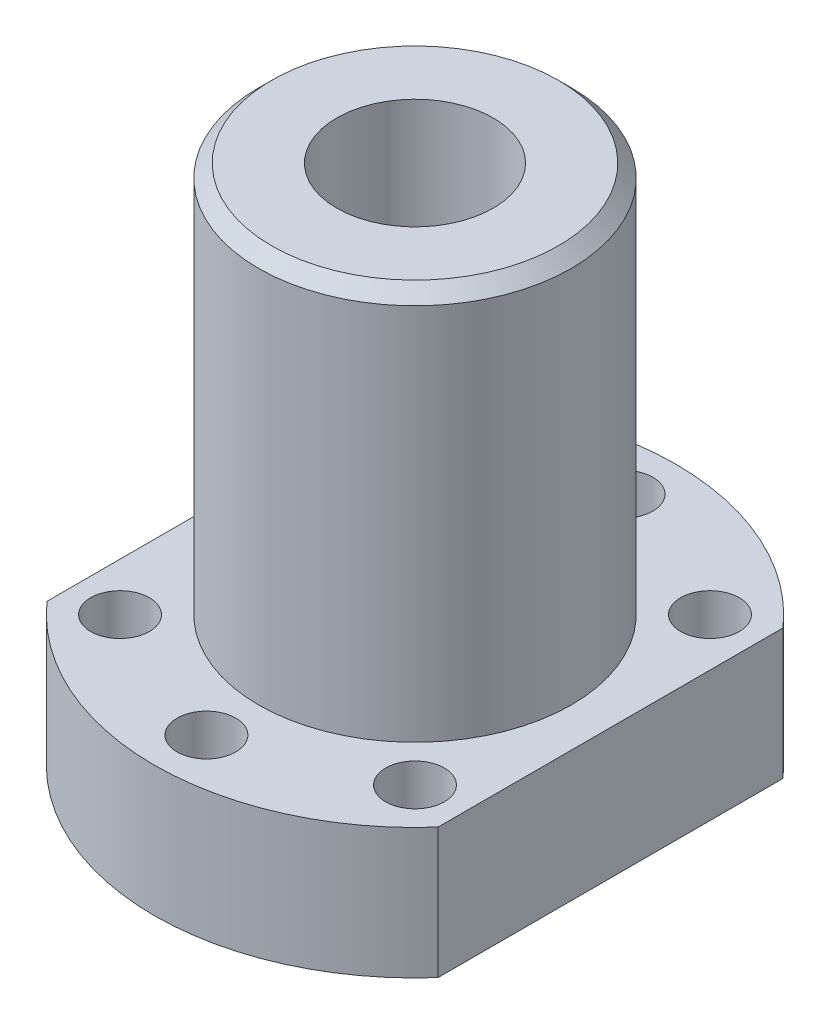
ISO-10303-21;
HEADER;
FILE_DESCRIPTION(('STEP AP214'),'2;1');
FILE_NAME('part.step','',(''),(''),'','','');
FILE_SCHEMA(('AUTOMOTIVE_DESIGN { 1 0 10303 214 1 1 1 1 }'));
ENDSEC;
DATA;
#1=APPLICATION_CONTEXT('core data for automotive mechanical design processes');
#2=APPLICATION_PROTOCOL_DEFINITION('international standard','automotive_design',2000,#1);
#3=PRODUCT_CONTEXT('',#1,'mechanical');
#4=PRODUCT('Part','Part','',(#3));
#5=PRODUCT_RELATED_PRODUCT_CATEGORY('part','',(#4));
#6=PRODUCT_DEFINITION_FORMATION('','',#4);
#7=PRODUCT_DEFINITION_CONTEXT('part definition',#1,'design');
#8=PRODUCT_DEFINITION('design','',#6,#7);
#9=PRODUCT_DEFINITION_SHAPE('','',#8);
#10=(LENGTH_UNIT() NAMED_UNIT(*) SI_UNIT(.MILLI.,.METRE.));
#11=(NAMED_UNIT(*) PLANE_ANGLE_UNIT() SI_UNIT($,.RADIAN.));
#12=(NAMED_UNIT(*) SI_UNIT($,.STERADIAN.) SOLID_ANGLE_UNIT());
#13=UNCERTAINTY_MEASURE_WITH_UNIT(LENGTH_MEASURE(1.E-05),#10,'distance_accuracy_value','');
#14=(GEOMETRIC_REPRESENTATION_CONTEXT(3) GLOBAL_UNCERTAINTY_ASSIGNED_CONTEXT((#13)) GLOBAL_UNIT_ASSIGNED_CONTEXT((#10,
#11,#12)) REPRESENTATION_CONTEXT('',''));
#15=CARTESIAN_POINT('',(0.,0.,0.));
#16=DIRECTION('',(0.,0.,1.));
#17=DIRECTION('',(1.,0.,0.));
#18=AXIS2_PLACEMENT_3D('',#15,#16,#17);
#19=CARTESIAN_POINT('',(0.,10.,0.));
#20=DIRECTION('',(0.,-1.,0.));
#21=DIRECTION('',(0.,0.,-1.));
#22=AXIS2_PLACEMENT_3D('',#19,#20,#21);
#23=PLANE('',#22);
#24=CARTESIAN_POINT('',(11.3137084989863,10.,11.3137084989862));
#25=DIRECTION('',(0.,1.,0.));
#26=DIRECTION('',(0.,0.,-1.));
#27=AXIS2_PLACEMENT_3D('',#24,#25,#26);
#28=CIRCLE('',#27,2.24999999999939);
#29=CARTESIAN_POINT('',(11.3137084989863,10.,9.06370849898682));
#30=VERTEX_POINT('',#29);
#31=EDGE_CURVE('E175',#30,#30,#28,.T.);
#32=ORIENTED_EDGE('',*,*,#31,.F.);
#33=EDGE_LOOP('',(#32));
#34=FACE_BOUND('',#33,.T.);
#35=CARTESIAN_POINT('',(0.,10.,16.));
#36=DIRECTION('',(0.,1.,0.));
#37=DIRECTION('',(0.,0.,-1.));
#38=AXIS2_PLACEMENT_3D('',#35,#36,#37);
#39=CIRCLE('',#38,2.25);
#40=CARTESIAN_POINT('',(0.,10.,13.75));
#41=VERTEX_POINT('',#40);
#42=EDGE_CURVE('E184',#41,#41,#39,.T.);
#43=ORIENTED_EDGE('',*,*,#42,.F.);
#44=EDGE_LOOP('',(#43));
#45=FACE_BOUND('',#44,.T.);
#46=CARTESIAN_POINT('',(-11.3137084989863,10.,11.3137084989862));
#47=DIRECTION('',(0.,1.,0.));
#48=DIRECTION('',(0.,0.,1.));
#49=AXIS2_PLACEMENT_3D('',#46,#47,#48);
#50=CIRCLE('',#49,2.24999999999939);
#51=CARTESIAN_POINT('',(-11.3137084989863,10.,13.5637084989856));
#52=VERTEX_POINT('',#51);
#53=EDGE_CURVE('E189',#52,#52,#50,.T.);
#54=ORIENTED_EDGE('',*,*,#53,.F.);
#55=EDGE_LOOP('',(#54));
#56=FACE_BOUND('',#55,.T.);
#57=CARTESIAN_POINT('',(11.3137084989863,10.,-11.3137084989862));
#58=DIRECTION('',(0.,1.,0.));
#59=DIRECTION('',(0.,0.,1.));
#60=AXIS2_PLACEMENT_3D('',#57,#58,#59);
#61=CIRCLE('',#60,2.24999999999939);
#62=CARTESIAN_POINT('',(11.3137084989863,10.,-9.06370849898682));
#63=VERTEX_POINT('',#62);
#64=EDGE_CURVE('E194',#63,#63,#61,.T.);
#65=ORIENTED_EDGE('',*,*,#64,.F.);
#66=EDGE_LOOP('',(#65));
#67=FACE_BOUND('',#66,.T.);
#68=CARTESIAN_POINT('',(0.,10.,-16.));
#69=DIRECTION('',(0.,1.,0.));
#70=DIRECTION('',(0.,0.,1.));
#71=AXIS2_PLACEMENT_3D('',#68,#69,#70);
#72=CIRCLE('',#71,2.25);
#73=CARTESIAN_POINT('',(0.,10.,-13.75));
#74=VERTEX_POINT('',#73);
#75=EDGE_CURVE('E199',#74,#74,#72,.T.);
#76=ORIENTED_EDGE('',*,*,#75,.F.);
#77=EDGE_LOOP('',(#76));
#78=FACE_BOUND('',#77,.T.);
#79=CARTESIAN_POINT('',(-11.3137084989863,10.,-11.3137084989862));
#80=DIRECTION('',(0.,1.,0.));
#81=DIRECTION('',(0.,0.,-1.));
#82=AXIS2_PLACEMENT_3D('',#79,#80,#81);
#83=CIRCLE('',#82,2.24999999999939);
#84=CARTESIAN_POINT('',(-11.3137084989863,10.,-13.5637084989856));
#85=VERTEX_POINT('',#84);
#86=EDGE_CURVE('E204',#85,#85,#83,.T.);
#87=ORIENTED_EDGE('',*,*,#86,.F.);
#88=EDGE_LOOP('',(#87));
#89=FACE_BOUND('',#88,.T.);
#90=CARTESIAN_POINT('',(0.,10.,0.));
#91=DIRECTION('',(0.,1.,0.));
#92=DIRECTION('',(0.,0.,-1.));
#93=AXIS2_PLACEMENT_3D('',#90,#91,#92);
#94=CIRCLE('',#93,20.);
#95=CARTESIAN_POINT('',(15.,10.,-13.2287565553229));
#96=VERTEX_POINT('',#95);
#97=CARTESIAN_POINT('',(-15.,10.,-13.2287565553229));
#98=VERTEX_POINT('',#97);
#99=EDGE_CURVE('E89',#96,#98,#94,.T.);
#100=ORIENTED_EDGE('',*,*,#99,.T.);
#101=DIRECTION('',(0.,0.,1.));
#102=VECTOR('',#101,1.);
#103=CARTESIAN_POINT('',(-15.,10.,-13.2287565553229));
#104=LINE('',#103,#102);
#105=CARTESIAN_POINT('',(-15.,10.,13.2287565553229));
#106=VERTEX_POINT('',#105);
#107=EDGE_CURVE('E84',#98,#106,#104,.T.);
#108=ORIENTED_EDGE('',*,*,#107,.T.);
#109=CARTESIAN_POINT('',(0.,10.,0.));
#110=DIRECTION('',(0.,1.,0.));
#111=DIRECTION('',(0.,0.,1.));
#112=AXIS2_PLACEMENT_3D('',#109,#110,#111);
#113=CIRCLE('',#112,20.);
#114=CARTESIAN_POINT('',(15.,10.,13.2287565553229));
#115=VERTEX_POINT('',#114);
#116=EDGE_CURVE('E87',#106,#115,#113,.T.);
#117=ORIENTED_EDGE('',*,*,#116,.T.);
#118=DIRECTION('',(0.,0.,-1.));
#119=VECTOR('',#118,1.);
#120=CARTESIAN_POINT('',(15.,10.,-13.2287565553229));
#121=LINE('',#120,#119);
#122=EDGE_CURVE('E53',#115,#96,#121,.T.);
#123=ORIENTED_EDGE('',*,*,#122,.T.);
#124=EDGE_LOOP('',(#100,#108,#117,#123));
#125=FACE_BOUND('',#124,.T.);
#126=CARTESIAN_POINT('',(0.,10.,0.));
#127=DIRECTION('',(0.,-1.,0.));
#128=DIRECTION('',(0.,0.,-1.));
#129=AXIS2_PLACEMENT_3D('',#126,#127,#128);
#130=CIRCLE('',#129,12.);
#131=CARTESIAN_POINT('',(0.,10.,-12.));
#132=VERTEX_POINT('',#131);
#133=EDGE_CURVE('E114',#132,#132,#130,.F.);
#134=ORIENTED_EDGE('',*,*,#133,.F.);
#135=EDGE_LOOP('',(#134));
#136=FACE_BOUND('',#135,.T.);
#137=ADVANCED_FACE('F36',(#34,#45,#56,#67,#78,#89,#125,#136),#23,.F.);
#138=CARTESIAN_POINT('',(0.,0.,0.));
#139=DIRECTION('',(0.,-1.,0.));
#140=DIRECTION('',(0.,0.,-1.));
#141=AXIS2_PLACEMENT_3D('',#138,#139,#140);
#142=PLANE('',#141);
#143=CARTESIAN_POINT('',(0.,0.,16.));
#144=DIRECTION('',(0.,1.,0.));
#145=DIRECTION('',(0.,0.,-1.));
#146=AXIS2_PLACEMENT_3D('',#143,#144,#145);
#147=CIRCLE('',#146,2.25);
#148=CARTESIAN_POINT('',(0.,0.,13.75));
#149=VERTEX_POINT('',#148);
#150=EDGE_CURVE('E179',#149,#149,#147,.T.);
#151=ORIENTED_EDGE('',*,*,#150,.T.);
#152=EDGE_LOOP('',(#151));
#153=FACE_BOUND('',#152,.T.);
#154=CARTESIAN_POINT('',(11.3137084989863,0.,-11.3137084989862));
#155=DIRECTION('',(0.,1.,0.));
#156=DIRECTION('',(0.,0.,1.));
#157=AXIS2_PLACEMENT_3D('',#154,#155,#156);
#158=CIRCLE('',#157,2.24999999999939);
#159=CARTESIAN_POINT('',(11.3137084989863,0.,-9.06370849898682));
#160=VERTEX_POINT('',#159);
#161=EDGE_CURVE('E192',#160,#160,#158,.T.);
#162=ORIENTED_EDGE('',*,*,#161,.T.);
#163=EDGE_LOOP('',(#162));
#164=FACE_BOUND('',#163,.T.);
#165=CARTESIAN_POINT('',(-11.3137084989863,0.,-11.3137084989862));
#166=DIRECTION('',(0.,1.,0.));
#167=DIRECTION('',(0.,0.,-1.));
#168=AXIS2_PLACEMENT_3D('',#165,#166,#167);
#169=CIRCLE('',#168,2.24999999999939);
#170=CARTESIAN_POINT('',(-11.3137084989863,0.,-13.5637084989856));
#171=VERTEX_POINT('',#170);
#172=EDGE_CURVE('E202',#171,#171,#169,.T.);
#173=ORIENTED_EDGE('',*,*,#172,.T.);
#174=EDGE_LOOP('',(#173));
#175=FACE_BOUND('',#174,.T.);
#176=CARTESIAN_POINT('',(0.,0.,0.));
#177=DIRECTION('',(0.,1.,0.));
#178=DIRECTION('',(0.,0.,-1.));
#179=AXIS2_PLACEMENT_3D('',#176,#177,#178);
#180=CIRCLE('',#179,20.);
#181=CARTESIAN_POINT('',(15.,0.,-13.2287565553229));
#182=VERTEX_POINT('',#181);
#183=CARTESIAN_POINT('',(-15.,0.,-13.2287565553229));
#184=VERTEX_POINT('',#183);
#185=EDGE_CURVE('E104',#182,#184,#180,.T.);
#186=ORIENTED_EDGE('',*,*,#185,.F.);
#187=DIRECTION('',(0.,0.,-1.));
#188=VECTOR('',#187,1.);
#189=CARTESIAN_POINT('',(15.,0.,-13.2287565553229));
#190=LINE('',#189,#188);
#191=CARTESIAN_POINT('',(15.,0.,13.2287565553229));
#192=VERTEX_POINT('',#191);
#193=EDGE_CURVE('E76',#192,#182,#190,.T.);
#194=ORIENTED_EDGE('',*,*,#193,.F.);
#195=CARTESIAN_POINT('',(0.,0.,0.));
#196=DIRECTION('',(0.,1.,0.));
#197=DIRECTION('',(0.,0.,1.));
#198=AXIS2_PLACEMENT_3D('',#195,#196,#197);
#199=CIRCLE('',#198,20.);
#200=CARTESIAN_POINT('',(-15.,0.,13.2287565553229));
#201=VERTEX_POINT('',#200);
#202=EDGE_CURVE('E70',#201,#192,#199,.T.);
#203=ORIENTED_EDGE('',*,*,#202,.F.);
#204=DIRECTION('',(0.,0.,1.));
#205=VECTOR('',#204,1.);
#206=CARTESIAN_POINT('',(-15.,0.,-13.2287565553229));
#207=LINE('',#206,#205);
#208=EDGE_CURVE('E94',#184,#201,#207,.T.);
#209=ORIENTED_EDGE('',*,*,#208,.F.);
#210=EDGE_LOOP('',(#186,#194,#203,#209));
#211=FACE_BOUND('',#210,.T.);
#212=CARTESIAN_POINT('',(0.,0.,0.));
#213=DIRECTION('',(0.,1.,0.));
#214=DIRECTION('',(0.,0.,1.));
#215=AXIS2_PLACEMENT_3D('',#212,#213,#214);
#216=CIRCLE('',#215,6.);
#217=CARTESIAN_POINT('',(0.,0.,6.));
#218=VERTEX_POINT('',#217);
#219=EDGE_CURVE('E107',#218,#218,#216,.T.);
#220=ORIENTED_EDGE('',*,*,#219,.T.);
#221=EDGE_LOOP('',(#220));
#222=FACE_BOUND('',#221,.T.);
#223=CARTESIAN_POINT('',(0.,0.,-16.));
#224=DIRECTION('',(0.,1.,0.));
#225=DIRECTION('',(0.,0.,1.));
#226=AXIS2_PLACEMENT_3D('',#223,#224,#225);
#227=CIRCLE('',#226,2.25);
#228=CARTESIAN_POINT('',(0.,0.,-13.75));
#229=VERTEX_POINT('',#228);
#230=EDGE_CURVE('E166',#229,#229,#227,.T.);
#231=ORIENTED_EDGE('',*,*,#230,.T.);
#232=EDGE_LOOP('',(#231));
#233=FACE_BOUND('',#232,.T.);
#234=CARTESIAN_POINT('',(-11.3137084989863,0.,11.3137084989862));
#235=DIRECTION('',(0.,1.,0.));
#236=DIRECTION('',(0.,0.,1.));
#237=AXIS2_PLACEMENT_3D('',#234,#235,#236);
#238=CIRCLE('',#237,2.24999999999939);
#239=CARTESIAN_POINT('',(-11.3137084989863,0.,13.5637084989856));
#240=VERTEX_POINT('',#239);
#241=EDGE_CURVE('E170',#240,#240,#238,.T.);
#242=ORIENTED_EDGE('',*,*,#241,.T.);
#243=EDGE_LOOP('',(#242));
#244=FACE_BOUND('',#243,.T.);
#245=CARTESIAN_POINT('',(11.3137084989863,0.,11.3137084989862));
#246=DIRECTION('',(0.,1.,0.));
#247=DIRECTION('',(0.,0.,-1.));
#248=AXIS2_PLACEMENT_3D('',#245,#246,#247);
#249=CIRCLE('',#248,2.24999999999939);
#250=CARTESIAN_POINT('',(11.3137084989863,0.,9.06370849898682));
#251=VERTEX_POINT('',#250);
#252=EDGE_CURVE('E173',#251,#251,#249,.T.);
#253=ORIENTED_EDGE('',*,*,#252,.T.);
#254=EDGE_LOOP('',(#253));
#255=FACE_BOUND('',#254,.T.);
#256=ADVANCED_FACE('F132',(#153,#164,#175,#211,#222,#233,#244,#255),#142,.T.);
#257=CARTESIAN_POINT('',(0.,10.,0.));
#258=DIRECTION('',(0.,-1.,0.));
#259=DIRECTION('',(0.,0.,-1.));
#260=AXIS2_PLACEMENT_3D('',#257,#258,#259);
#261=CYLINDRICAL_SURFACE('',#260,20.);
#262=ORIENTED_EDGE('',*,*,#185,.T.);
#263=DIRECTION('',(0.,-1.,0.));
#264=VECTOR('',#263,1.);
#265=CARTESIAN_POINT('',(-15.,10.,-13.2287565553229));
#266=LINE('',#265,#264);
#267=EDGE_CURVE('E95',#98,#184,#266,.T.);
#268=ORIENTED_EDGE('',*,*,#267,.F.);
#269=ORIENTED_EDGE('',*,*,#99,.F.);
#270=DIRECTION('',(0.,-1.,0.));
#271=VECTOR('',#270,1.);
#272=CARTESIAN_POINT('',(15.,10.,-13.2287565553229));
#273=LINE('',#272,#271);
#274=EDGE_CURVE('E100',#96,#182,#273,.T.);
#275=ORIENTED_EDGE('',*,*,#274,.T.);
#276=EDGE_LOOP('',(#262,#268,#269,#275));
#277=FACE_BOUND('',#276,.T.);
#278=ADVANCED_FACE('F138',(#277),#261,.T.);
#279=CARTESIAN_POINT('',(-15.,10.,-13.2287565553229));
#280=DIRECTION('',(1.,0.,0.));
#281=DIRECTION('',(0.,0.,-1.));
#282=AXIS2_PLACEMENT_3D('',#279,#280,#281);
#283=PLANE('',#282);
#284=ORIENTED_EDGE('',*,*,#208,.T.);
#285=DIRECTION('',(0.,-1.,0.));
#286=VECTOR('',#285,1.);
#287=CARTESIAN_POINT('',(-15.,10.,13.2287565553229));
#288=LINE('',#287,#286);
#289=EDGE_CURVE('E92',#106,#201,#288,.T.);
#290=ORIENTED_EDGE('',*,*,#289,.F.);
#291=ORIENTED_EDGE('',*,*,#107,.F.);
#292=ORIENTED_EDGE('',*,*,#267,.T.);
#293=EDGE_LOOP('',(#284,#290,#291,#292));
#294=FACE_BOUND('',#293,.T.);
#295=ADVANCED_FACE('F93',(#294),#283,.F.);
#296=CARTESIAN_POINT('',(0.,10.,0.));
#297=DIRECTION('',(0.,-1.,0.));
#298=DIRECTION('',(0.,0.,-1.));
#299=AXIS2_PLACEMENT_3D('',#296,#297,#298);
#300=CYLINDRICAL_SURFACE('',#299,20.);
#301=ORIENTED_EDGE('',*,*,#202,.T.);
#302=DIRECTION('',(0.,-1.,0.));
#303=VECTOR('',#302,1.);
#304=CARTESIAN_POINT('',(15.,10.,13.2287565553229));
#305=LINE('',#304,#303);
#306=EDGE_CURVE('E96',#115,#192,#305,.T.);
#307=ORIENTED_EDGE('',*,*,#306,.F.);
#308=ORIENTED_EDGE('',*,*,#116,.F.);
#309=ORIENTED_EDGE('',*,*,#289,.T.);
#310=EDGE_LOOP('',(#301,#307,#308,#309));
#311=FACE_BOUND('',#310,.T.);
#312=ADVANCED_FACE('F98',(#311),#300,.T.);
#313=CARTESIAN_POINT('',(15.,10.,-13.2287565553229));
#314=DIRECTION('',(-1.,0.,0.));
#315=DIRECTION('',(0.,0.,1.));
#316=AXIS2_PLACEMENT_3D('',#313,#314,#315);
#317=PLANE('',#316);
#318=ORIENTED_EDGE('',*,*,#193,.T.);
#319=ORIENTED_EDGE('',*,*,#274,.F.);
#320=ORIENTED_EDGE('',*,*,#122,.F.);
#321=ORIENTED_EDGE('',*,*,#306,.T.);
#322=EDGE_LOOP('',(#318,#319,#320,#321));
#323=FACE_BOUND('',#322,.T.);
#324=ADVANCED_FACE('F147',(#323),#317,.F.);
#325=CARTESIAN_POINT('',(0.,10.,0.));
#326=DIRECTION('',(0.,-1.,0.));
#327=DIRECTION('',(0.,0.,-1.));
#328=AXIS2_PLACEMENT_3D('',#325,#326,#327);
#329=CYLINDRICAL_SURFACE('',#328,6.);
#330=ORIENTED_EDGE('',*,*,#219,.F.);
#331=EDGE_LOOP('',(#330));
#332=FACE_BOUND('',#331,.T.);
#333=CARTESIAN_POINT('',(0.,40.,0.));
#334=DIRECTION('',(0.,1.,0.));
#335=DIRECTION('',(0.,0.,1.));
#336=AXIS2_PLACEMENT_3D('',#333,#334,#335);
#337=CIRCLE('',#336,6.);
#338=CARTESIAN_POINT('',(0.,40.,6.));
#339=VERTEX_POINT('',#338);
#340=EDGE_CURVE('E176',#339,#339,#337,.T.);
#341=ORIENTED_EDGE('',*,*,#340,.T.);
#342=EDGE_LOOP('',(#341));
#343=FACE_BOUND('',#342,.T.);
#344=ADVANCED_FACE('F144',(#332,#343),#329,.F.);
#345=CARTESIAN_POINT('',(-11.3137084989863,10.,-11.3137084989862));
#346=DIRECTION('',(0.,-1.,0.));
#347=DIRECTION('',(0.,0.,-1.));
#348=AXIS2_PLACEMENT_3D('',#345,#346,#347);
#349=CYLINDRICAL_SURFACE('',#348,2.24999999999939);
#350=ORIENTED_EDGE('',*,*,#86,.T.);
#351=EDGE_LOOP('',(#350));
#352=FACE_BOUND('',#351,.T.);
#353=ORIENTED_EDGE('',*,*,#172,.F.);
#354=EDGE_LOOP('',(#353));
#355=FACE_BOUND('',#354,.T.);
#356=ADVANCED_FACE('F212',(#352,#355),#349,.F.);
#357=CARTESIAN_POINT('',(0.,10.,-16.));
#358=DIRECTION('',(0.,-1.,0.));
#359=DIRECTION('',(0.,0.,-1.));
#360=AXIS2_PLACEMENT_3D('',#357,#358,#359);
#361=CYLINDRICAL_SURFACE('',#360,2.25);
#362=ORIENTED_EDGE('',*,*,#75,.T.);
#363=EDGE_LOOP('',(#362));
#364=FACE_BOUND('',#363,.T.);
#365=ORIENTED_EDGE('',*,*,#230,.F.);
#366=EDGE_LOOP('',(#365));
#367=FACE_BOUND('',#366,.T.);
#368=ADVANCED_FACE('F214',(#364,#367),#361,.F.);
#369=CARTESIAN_POINT('',(11.3137084989863,10.,-11.3137084989862));
#370=DIRECTION('',(0.,-1.,0.));
#371=DIRECTION('',(0.,0.,-1.));
#372=AXIS2_PLACEMENT_3D('',#369,#370,#371);
#373=CYLINDRICAL_SURFACE('',#372,2.24999999999939);
#374=ORIENTED_EDGE('',*,*,#64,.T.);
#375=EDGE_LOOP('',(#374));
#376=FACE_BOUND('',#375,.T.);
#377=ORIENTED_EDGE('',*,*,#161,.F.);
#378=EDGE_LOOP('',(#377));
#379=FACE_BOUND('',#378,.T.);
#380=ADVANCED_FACE('F220',(#376,#379),#373,.F.);
#381=CARTESIAN_POINT('',(-11.3137084989863,10.,11.3137084989862));
#382=DIRECTION('',(0.,-1.,0.));
#383=DIRECTION('',(0.,0.,-1.));
#384=AXIS2_PLACEMENT_3D('',#381,#382,#383);
#385=CYLINDRICAL_SURFACE('',#384,2.24999999999939);
#386=ORIENTED_EDGE('',*,*,#53,.T.);
#387=EDGE_LOOP('',(#386));
#388=FACE_BOUND('',#387,.T.);
#389=ORIENTED_EDGE('',*,*,#241,.F.);
#390=EDGE_LOOP('',(#389));
#391=FACE_BOUND('',#390,.T.);
#392=ADVANCED_FACE('F227',(#388,#391),#385,.F.);
#393=CARTESIAN_POINT('',(0.,10.,16.));
#394=DIRECTION('',(0.,-1.,0.));
#395=DIRECTION('',(0.,0.,-1.));
#396=AXIS2_PLACEMENT_3D('',#393,#394,#395);
#397=CYLINDRICAL_SURFACE('',#396,2.25);
#398=ORIENTED_EDGE('',*,*,#42,.T.);
#399=EDGE_LOOP('',(#398));
#400=FACE_BOUND('',#399,.T.);
#401=ORIENTED_EDGE('',*,*,#150,.F.);
#402=EDGE_LOOP('',(#401));
#403=FACE_BOUND('',#402,.T.);
#404=ADVANCED_FACE('F231',(#400,#403),#397,.F.);
#405=CARTESIAN_POINT('',(11.3137084989863,10.,11.3137084989862));
#406=DIRECTION('',(0.,-1.,0.));
#407=DIRECTION('',(0.,0.,-1.));
#408=AXIS2_PLACEMENT_3D('',#405,#406,#407);
#409=CYLINDRICAL_SURFACE('',#408,2.24999999999939);
#410=ORIENTED_EDGE('',*,*,#31,.T.);
#411=EDGE_LOOP('',(#410));
#412=FACE_BOUND('',#411,.T.);
#413=ORIENTED_EDGE('',*,*,#252,.F.);
#414=EDGE_LOOP('',(#413));
#415=FACE_BOUND('',#414,.T.);
#416=ADVANCED_FACE('F235',(#412,#415),#409,.F.);
#417=CARTESIAN_POINT('',(0.,40.,0.));
#418=DIRECTION('',(0.,1.,0.));
#419=DIRECTION('',(0.,0.,1.));
#420=AXIS2_PLACEMENT_3D('',#417,#418,#419);
#421=PLANE('',#420);
#422=CARTESIAN_POINT('',(0.,40.,0.));
#423=DIRECTION('',(0.,1.,0.));
#424=DIRECTION('',(0.,0.,1.));
#425=AXIS2_PLACEMENT_3D('',#422,#423,#424);
#426=CIRCLE('',#425,11.);
#427=CARTESIAN_POINT('',(0.,40.,11.));
#428=VERTEX_POINT('',#427);
#429=EDGE_CURVE('E45',#428,#428,#426,.T.);
#430=ORIENTED_EDGE('',*,*,#429,.T.);
#431=EDGE_LOOP('',(#430));
#432=FACE_BOUND('',#431,.T.);
#433=ORIENTED_EDGE('',*,*,#340,.F.);
#434=EDGE_LOOP('',(#433));
#435=FACE_BOUND('',#434,.T.);
#436=ADVANCED_FACE('F119',(#432,#435),#421,.T.);
#437=CARTESIAN_POINT('',(0.,40.,0.));
#438=DIRECTION('',(0.,-1.,0.));
#439=DIRECTION('',(0.,0.,-1.));
#440=AXIS2_PLACEMENT_3D('',#437,#438,#439);
#441=CYLINDRICAL_SURFACE('',#440,12.);
#442=CARTESIAN_POINT('',(0.,39.,0.));
#443=DIRECTION('',(0.,1.,0.));
#444=DIRECTION('',(0.,0.,1.));
#445=AXIS2_PLACEMENT_3D('',#442,#443,#444);
#446=CIRCLE('',#445,12.);
#447=CARTESIAN_POINT('',(0.,39.,12.));
#448=VERTEX_POINT('',#447);
#449=EDGE_CURVE('E11',#448,#448,#446,.F.);
#450=ORIENTED_EDGE('',*,*,#449,.T.);
#451=EDGE_LOOP('',(#450));
#452=FACE_BOUND('',#451,.T.);
#453=ORIENTED_EDGE('',*,*,#133,.T.);
#454=EDGE_LOOP('',(#453));
#455=FACE_BOUND('',#454,.T.);
#456=ADVANCED_FACE('F123',(#452,#455),#441,.T.);
#457=CARTESIAN_POINT('',(0.,40.,0.));
#458=DIRECTION('',(0.,-1.,0.));
#459=DIRECTION('',(0.,0.,-1.));
#460=AXIS2_PLACEMENT_3D('',#457,#458,#459);
#461=CONICAL_SURFACE('',#460,11.,0.785398163397447);
#462=ORIENTED_EDGE('',*,*,#449,.F.);
#463=EDGE_LOOP('',(#462));
#464=FACE_BOUND('',#463,.T.);
#465=ORIENTED_EDGE('',*,*,#429,.F.);
#466=EDGE_LOOP('',(#465));
#467=FACE_BOUND('',#466,.T.);
#468=ADVANCED_FACE('F38',(#464,#467),#461,.T.);
#469=CLOSED_SHELL('',(#137,#256,#278,#295,#312,#324,#344,#356,#368,#380,#392,#404,#416,#436,
#456,#468));
#470=MANIFOLD_SOLID_BREP('B2',#469);
#471=ADVANCED_BREP_SHAPE_REPRESENTATION('',(#18,#470),#14);
#472=SHAPE_DEFINITION_REPRESENTATION(#9,#471);
ENDSEC;
END-ISO-10303-21;
